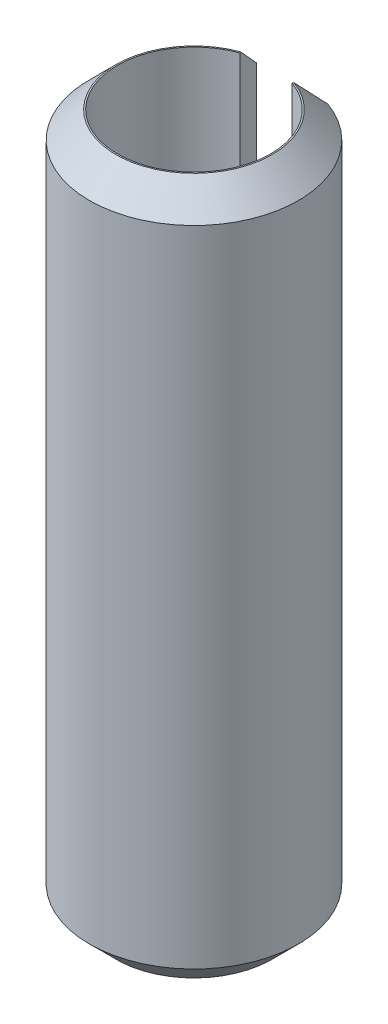
ISO-10303-21;
HEADER;
FILE_DESCRIPTION(('STEP AP214'),'2;1');
FILE_NAME('part.step','',(''),(''),'','','');
FILE_SCHEMA(('AUTOMOTIVE_DESIGN { 1 0 10303 214 1 1 1 1 }'));
ENDSEC;
DATA;
#1=APPLICATION_CONTEXT('core data for automotive mechanical design processes');
#2=APPLICATION_PROTOCOL_DEFINITION('international standard','automotive_design',2000,#1);
#3=PRODUCT_CONTEXT('',#1,'mechanical');
#4=PRODUCT('Part','Part','',(#3));
#5=PRODUCT_RELATED_PRODUCT_CATEGORY('part','',(#4));
#6=PRODUCT_DEFINITION_FORMATION('','',#4);
#7=PRODUCT_DEFINITION_CONTEXT('part definition',#1,'design');
#8=PRODUCT_DEFINITION('design','',#6,#7);
#9=PRODUCT_DEFINITION_SHAPE('','',#8);
#10=(LENGTH_UNIT() NAMED_UNIT(*) SI_UNIT(.MILLI.,.METRE.));
#11=(NAMED_UNIT(*) PLANE_ANGLE_UNIT() SI_UNIT($,.RADIAN.));
#12=(NAMED_UNIT(*) SI_UNIT($,.STERADIAN.) SOLID_ANGLE_UNIT());
#13=UNCERTAINTY_MEASURE_WITH_UNIT(LENGTH_MEASURE(1.E-05),#10,'distance_accuracy_value','');
#14=(GEOMETRIC_REPRESENTATION_CONTEXT(3) GLOBAL_UNCERTAINTY_ASSIGNED_CONTEXT((#13)) GLOBAL_UNIT_ASSIGNED_CONTEXT((#10,
#11,#12)) REPRESENTATION_CONTEXT('',''));
#15=CARTESIAN_POINT('',(0.,0.,0.));
#16=DIRECTION('',(0.,0.,1.));
#17=DIRECTION('',(1.,0.,0.));
#18=AXIS2_PLACEMENT_3D('',#15,#16,#17);
#19=CARTESIAN_POINT('',(0.,5.,0.));
#20=DIRECTION('',(0.,-1.,0.));
#21=DIRECTION('',(0.,0.,-1.));
#22=AXIS2_PLACEMENT_3D('',#19,#20,#21);
#23=CYLINDRICAL_SURFACE('',#22,0.55);
#24=CARTESIAN_POINT('',(0.,0.,0.));
#25=DIRECTION('',(0.,-1.,0.));
#26=DIRECTION('',(0.,0.,1.));
#27=AXIS2_PLACEMENT_3D('',#24,#25,#26);
#28=CIRCLE('',#27,0.55);
#29=CARTESIAN_POINT('',(0.188111078829104,0.,-0.516830941432255));
#30=VERTEX_POINT('',#29);
#31=CARTESIAN_POINT('',(-0.188111078829104,0.,-0.516830941432255));
#32=VERTEX_POINT('',#31);
#33=EDGE_CURVE('E116',#30,#32,#28,.T.);
#34=ORIENTED_EDGE('',*,*,#33,.T.);
#35=DIRECTION('',(0.,-1.,0.));
#36=VECTOR('',#35,1.);
#37=CARTESIAN_POINT('',(-0.188111078829104,5.,-0.516830941432255));
#38=LINE('',#37,#36);
#39=CARTESIAN_POINT('',(-0.188111078829104,5.,-0.516830941432255));
#40=VERTEX_POINT('',#39);
#41=EDGE_CURVE('E100',#40,#32,#38,.T.);
#42=ORIENTED_EDGE('',*,*,#41,.F.);
#43=CARTESIAN_POINT('',(0.,5.,0.));
#44=DIRECTION('',(0.,-1.,0.));
#45=DIRECTION('',(0.,0.,1.));
#46=AXIS2_PLACEMENT_3D('',#43,#44,#45);
#47=CIRCLE('',#46,0.55);
#48=CARTESIAN_POINT('',(0.188111078829104,5.,-0.516830941432255));
#49=VERTEX_POINT('',#48);
#50=EDGE_CURVE('E105',#49,#40,#47,.T.);
#51=ORIENTED_EDGE('',*,*,#50,.F.);
#52=DIRECTION('',(0.,-1.,0.));
#53=VECTOR('',#52,1.);
#54=CARTESIAN_POINT('',(0.188111078829104,5.,-0.516830941432255));
#55=LINE('',#54,#53);
#56=EDGE_CURVE('E159',#49,#30,#55,.T.);
#57=ORIENTED_EDGE('',*,*,#56,.T.);
#58=EDGE_LOOP('',(#34,#42,#51,#57));
#59=FACE_BOUND('',#58,.T.);
#60=ADVANCED_FACE('F38',(#59),#23,.F.);
#61=CARTESIAN_POINT('',(-0.188111078829104,5.,-0.516830941432255));
#62=DIRECTION('',(-0.939692620785918,0.,0.342020143325643));
#63=DIRECTION('',(0.342020143325643,0.,0.939692620785918));
#64=AXIS2_PLACEMENT_3D('',#61,#62,#63);
#65=PLANE('',#64);
#66=DIRECTION('',(-0.342020143325643,0.,-0.939692620785918));
#67=VECTOR('',#66,1.);
#68=CARTESIAN_POINT('',(-0.188111078829104,0.,-0.516830941432255));
#69=LINE('',#68,#67);
#70=CARTESIAN_POINT('',(-0.191531280262359,0.,-0.526227867640112));
#71=VERTEX_POINT('',#70);
#72=EDGE_CURVE('E142',#32,#71,#69,.T.);
#73=ORIENTED_EDGE('',*,*,#72,.T.);
#74=DIRECTION('',(0.241844762647957,-0.707106781186546,0.664463024388683));
#75=VECTOR('',#74,1.);
#76=CARTESIAN_POINT('',(0.,-0.559999999999996,0.));
#77=LINE('',#76,#75);
#78=CARTESIAN_POINT('',(-0.256515107494232,0.190000000000002,-0.704769465589438));
#79=VERTEX_POINT('',#78);
#80=EDGE_CURVE('E47',#71,#79,#77,.F.);
#81=ORIENTED_EDGE('',*,*,#80,.T.);
#82=DIRECTION('',(0.,-1.,0.));
#83=VECTOR('',#82,1.);
#84=CARTESIAN_POINT('',(-0.256515107494232,5.,-0.704769465589438));
#85=LINE('',#84,#83);
#86=CARTESIAN_POINT('',(-0.256515107494232,4.81,-0.704769465589438));
#87=VERTEX_POINT('',#86);
#88=EDGE_CURVE('E119',#87,#79,#85,.T.);
#89=ORIENTED_EDGE('',*,*,#88,.F.);
#90=DIRECTION('',(-0.241844762647957,-0.707106781186547,-0.664463024388682));
#91=VECTOR('',#90,1.);
#92=CARTESIAN_POINT('',(0.,5.56,0.));
#93=LINE('',#92,#91);
#94=CARTESIAN_POINT('',(-0.19153128026236,5.,-0.526227867640114));
#95=VERTEX_POINT('',#94);
#96=EDGE_CURVE('E54',#87,#95,#93,.F.);
#97=ORIENTED_EDGE('',*,*,#96,.T.);
#98=DIRECTION('',(-0.342020143325643,0.,-0.939692620785918));
#99=VECTOR('',#98,1.);
#100=CARTESIAN_POINT('',(-0.188111078829104,5.,-0.516830941432255));
#101=LINE('',#100,#99);
#102=EDGE_CURVE('E96',#40,#95,#101,.T.);
#103=ORIENTED_EDGE('',*,*,#102,.F.);
#104=ORIENTED_EDGE('',*,*,#41,.T.);
#105=EDGE_LOOP('',(#73,#81,#89,#97,#103,#104));
#106=FACE_BOUND('',#105,.T.);
#107=ADVANCED_FACE('F98',(#106),#65,.F.);
#108=CARTESIAN_POINT('',(0.,5.,0.));
#109=DIRECTION('',(0.,-1.,0.));
#110=DIRECTION('',(0.,0.,-1.));
#111=AXIS2_PLACEMENT_3D('',#108,#109,#110);
#112=CYLINDRICAL_SURFACE('',#111,0.75);
#113=ORIENTED_EDGE('',*,*,#88,.T.);
#114=CARTESIAN_POINT('',(0.,0.190000000000002,0.));
#115=DIRECTION('',(0.,1.,0.));
#116=DIRECTION('',(0.,0.,1.));
#117=AXIS2_PLACEMENT_3D('',#114,#115,#116);
#118=CIRCLE('',#117,0.75);
#119=CARTESIAN_POINT('',(0.256515107494233,0.190000000000002,-0.704769465589438));
#120=VERTEX_POINT('',#119);
#121=EDGE_CURVE('E122',#79,#120,#118,.T.);
#122=ORIENTED_EDGE('',*,*,#121,.T.);
#123=DIRECTION('',(0.,-1.,0.));
#124=VECTOR('',#123,1.);
#125=CARTESIAN_POINT('',(0.256515107494233,5.,-0.704769465589438));
#126=LINE('',#125,#124);
#127=CARTESIAN_POINT('',(0.256515107494233,4.81,-0.704769465589438));
#128=VERTEX_POINT('',#127);
#129=EDGE_CURVE('E126',#128,#120,#126,.T.);
#130=ORIENTED_EDGE('',*,*,#129,.F.);
#131=CARTESIAN_POINT('',(0.,4.81,0.));
#132=DIRECTION('',(0.,1.,0.));
#133=DIRECTION('',(0.,0.,1.));
#134=AXIS2_PLACEMENT_3D('',#131,#132,#133);
#135=CIRCLE('',#134,0.75);
#136=EDGE_CURVE('E118',#128,#87,#135,.F.);
#137=ORIENTED_EDGE('',*,*,#136,.T.);
#138=EDGE_LOOP('',(#113,#122,#130,#137));
#139=FACE_BOUND('',#138,.T.);
#140=ADVANCED_FACE('F146',(#139),#112,.T.);
#141=CARTESIAN_POINT('',(0.188111078829104,5.,-0.516830941432255));
#142=DIRECTION('',(0.939692620785918,0.,0.342020143325643));
#143=DIRECTION('',(0.342020143325643,0.,-0.939692620785918));
#144=AXIS2_PLACEMENT_3D('',#141,#142,#143);
#145=PLANE('',#144);
#146=ORIENTED_EDGE('',*,*,#129,.T.);
#147=DIRECTION('',(0.241844762647958,0.707106781186546,-0.664463024388683));
#148=VECTOR('',#147,1.);
#149=CARTESIAN_POINT('',(0.,-0.559999999999996,0.));
#150=LINE('',#149,#148);
#151=CARTESIAN_POINT('',(0.191531280262359,0.,-0.526227867640112));
#152=VERTEX_POINT('',#151);
#153=EDGE_CURVE('E135',#120,#152,#150,.F.);
#154=ORIENTED_EDGE('',*,*,#153,.T.);
#155=DIRECTION('',(-0.342020143325643,0.,0.939692620785918));
#156=VECTOR('',#155,1.);
#157=CARTESIAN_POINT('',(0.188111078829104,0.,-0.516830941432255));
#158=LINE('',#157,#156);
#159=EDGE_CURVE('E113',#152,#30,#158,.T.);
#160=ORIENTED_EDGE('',*,*,#159,.T.);
#161=ORIENTED_EDGE('',*,*,#56,.F.);
#162=DIRECTION('',(-0.342020143325643,0.,0.939692620785918));
#163=VECTOR('',#162,1.);
#164=CARTESIAN_POINT('',(0.188111078829104,5.,-0.516830941432255));
#165=LINE('',#164,#163);
#166=CARTESIAN_POINT('',(0.19153128026236,5.,-0.526227867640114));
#167=VERTEX_POINT('',#166);
#168=EDGE_CURVE('E104',#167,#49,#165,.T.);
#169=ORIENTED_EDGE('',*,*,#168,.F.);
#170=DIRECTION('',(-0.241844762647957,0.707106781186547,0.664463024388682));
#171=VECTOR('',#170,1.);
#172=CARTESIAN_POINT('',(0.,5.56,0.));
#173=LINE('',#172,#171);
#174=EDGE_CURVE('E133',#167,#128,#173,.F.);
#175=ORIENTED_EDGE('',*,*,#174,.T.);
#176=EDGE_LOOP('',(#146,#154,#160,#161,#169,#175));
#177=FACE_BOUND('',#176,.T.);
#178=ADVANCED_FACE('F152',(#177),#145,.F.);
#179=CARTESIAN_POINT('',(0.,5.,0.));
#180=DIRECTION('',(0.,1.,0.));
#181=DIRECTION('',(0.,0.,1.));
#182=AXIS2_PLACEMENT_3D('',#179,#180,#181);
#183=PLANE('',#182);
#184=ORIENTED_EDGE('',*,*,#102,.T.);
#185=CARTESIAN_POINT('',(0.,5.,0.));
#186=DIRECTION('',(0.,1.,0.));
#187=DIRECTION('',(0.,0.,1.));
#188=AXIS2_PLACEMENT_3D('',#185,#186,#187);
#189=CIRCLE('',#188,0.56);
#190=EDGE_CURVE('E11',#95,#167,#189,.T.);
#191=ORIENTED_EDGE('',*,*,#190,.T.);
#192=ORIENTED_EDGE('',*,*,#168,.T.);
#193=ORIENTED_EDGE('',*,*,#50,.T.);
#194=EDGE_LOOP('',(#184,#191,#192,#193));
#195=FACE_BOUND('',#194,.T.);
#196=ADVANCED_FACE('F108',(#195),#183,.T.);
#197=CARTESIAN_POINT('',(0.,0.,0.));
#198=DIRECTION('',(0.,1.,0.));
#199=DIRECTION('',(0.,0.,1.));
#200=AXIS2_PLACEMENT_3D('',#197,#198,#199);
#201=PLANE('',#200);
#202=ORIENTED_EDGE('',*,*,#159,.F.);
#203=CARTESIAN_POINT('',(0.,0.,0.));
#204=DIRECTION('',(0.,1.,0.));
#205=DIRECTION('',(0.,0.,1.));
#206=AXIS2_PLACEMENT_3D('',#203,#204,#205);
#207=CIRCLE('',#206,0.559999999999998);
#208=EDGE_CURVE('E62',#152,#71,#207,.F.);
#209=ORIENTED_EDGE('',*,*,#208,.T.);
#210=ORIENTED_EDGE('',*,*,#72,.F.);
#211=ORIENTED_EDGE('',*,*,#33,.F.);
#212=EDGE_LOOP('',(#202,#209,#210,#211));
#213=FACE_BOUND('',#212,.T.);
#214=ADVANCED_FACE('F153',(#213),#201,.F.);
#215=CARTESIAN_POINT('',(0.,0.190000000000002,0.));
#216=DIRECTION('',(0.,1.,0.));
#217=DIRECTION('',(0.,0.,1.));
#218=AXIS2_PLACEMENT_3D('',#215,#216,#217);
#219=CONICAL_SURFACE('',#218,0.75,0.78539816339745);
#220=ORIENTED_EDGE('',*,*,#80,.F.);
#221=ORIENTED_EDGE('',*,*,#208,.F.);
#222=ORIENTED_EDGE('',*,*,#153,.F.);
#223=ORIENTED_EDGE('',*,*,#121,.F.);
#224=EDGE_LOOP('',(#220,#221,#222,#223));
#225=FACE_BOUND('',#224,.T.);
#226=ADVANCED_FACE('F150',(#225),#219,.T.);
#227=CARTESIAN_POINT('',(0.,5.,0.));
#228=DIRECTION('',(0.,-1.,0.));
#229=DIRECTION('',(0.,0.,-1.));
#230=AXIS2_PLACEMENT_3D('',#227,#228,#229);
#231=CONICAL_SURFACE('',#230,0.56,0.785398163397449);
#232=ORIENTED_EDGE('',*,*,#96,.F.);
#233=ORIENTED_EDGE('',*,*,#136,.F.);
#234=ORIENTED_EDGE('',*,*,#174,.F.);
#235=ORIENTED_EDGE('',*,*,#190,.F.);
#236=EDGE_LOOP('',(#232,#233,#234,#235));
#237=FACE_BOUND('',#236,.T.);
#238=ADVANCED_FACE('F41',(#237),#231,.T.);
#239=CLOSED_SHELL('',(#60,#107,#140,#178,#196,#214,#226,#238));
#240=MANIFOLD_SOLID_BREP('B2',#239);
#241=ADVANCED_BREP_SHAPE_REPRESENTATION('',(#18,#240),#14);
#242=SHAPE_DEFINITION_REPRESENTATION(#9,#241);
ENDSEC;
END-ISO-10303-21;
